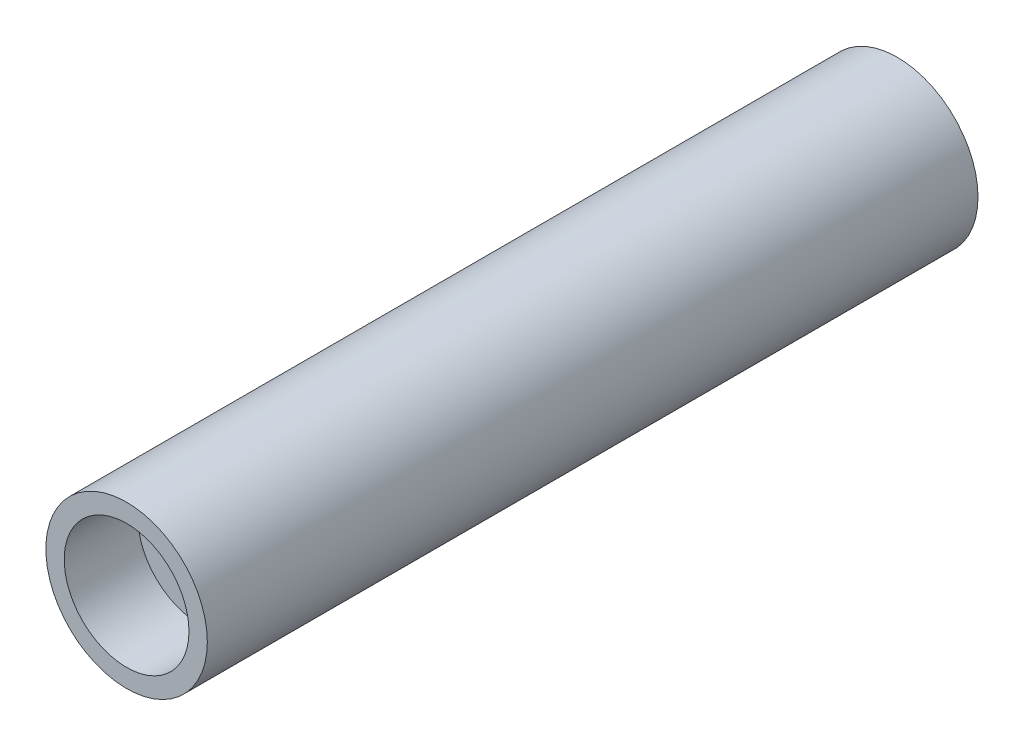
ISO-10303-21;
HEADER;
FILE_DESCRIPTION(('STEP AP214'),'2;1');
FILE_NAME('part.step','',(''),(''),'','','');
FILE_SCHEMA(('AUTOMOTIVE_DESIGN { 1 0 10303 214 1 1 1 1 }'));
ENDSEC;
DATA;
#1=APPLICATION_CONTEXT('core data for automotive mechanical design processes');
#2=APPLICATION_PROTOCOL_DEFINITION('international standard','automotive_design',2000,#1);
#3=PRODUCT_CONTEXT('',#1,'mechanical');
#4=PRODUCT('Part','Part','',(#3));
#5=PRODUCT_RELATED_PRODUCT_CATEGORY('part','',(#4));
#6=PRODUCT_DEFINITION_FORMATION('','',#4);
#7=PRODUCT_DEFINITION_CONTEXT('part definition',#1,'design');
#8=PRODUCT_DEFINITION('design','',#6,#7);
#9=PRODUCT_DEFINITION_SHAPE('','',#8);
#10=(LENGTH_UNIT() NAMED_UNIT(*) SI_UNIT(.MILLI.,.METRE.));
#11=(NAMED_UNIT(*) PLANE_ANGLE_UNIT() SI_UNIT($,.RADIAN.));
#12=(NAMED_UNIT(*) SI_UNIT($,.STERADIAN.) SOLID_ANGLE_UNIT());
#13=UNCERTAINTY_MEASURE_WITH_UNIT(LENGTH_MEASURE(1.E-05),#10,'distance_accuracy_value','');
#14=(GEOMETRIC_REPRESENTATION_CONTEXT(3) GLOBAL_UNCERTAINTY_ASSIGNED_CONTEXT((#13)) GLOBAL_UNIT_ASSIGNED_CONTEXT((#10,
#11,#12)) REPRESENTATION_CONTEXT('',''));
#15=CARTESIAN_POINT('',(0.,0.,0.));
#16=DIRECTION('',(0.,0.,1.));
#17=DIRECTION('',(1.,0.,0.));
#18=AXIS2_PLACEMENT_3D('',#15,#16,#17);
#19=CARTESIAN_POINT('',(0.,0.,-177.941839764448));
#20=DIRECTION('',(0.,0.,1.));
#21=DIRECTION('',(1.,0.,0.));
#22=AXIS2_PLACEMENT_3D('',#19,#20,#21);
#23=CYLINDRICAL_SURFACE('',#22,16.95);
#24=CARTESIAN_POINT('',(0.,0.,40.));
#25=DIRECTION('',(0.,0.,1.));
#26=DIRECTION('',(1.,0.,0.));
#27=AXIS2_PLACEMENT_3D('',#24,#25,#26);
#28=CIRCLE('',#27,16.95);
#29=CARTESIAN_POINT('',(16.95,0.,40.));
#30=VERTEX_POINT('',#29);
#31=EDGE_CURVE('E52',#30,#30,#28,.F.);
#32=ORIENTED_EDGE('',*,*,#31,.F.);
#33=EDGE_LOOP('',(#32));
#34=FACE_BOUND('',#33,.T.);
#35=CARTESIAN_POINT('',(0.,0.,190.));
#36=DIRECTION('',(0.,0.,1.));
#37=DIRECTION('',(1.,0.,0.));
#38=AXIS2_PLACEMENT_3D('',#35,#36,#37);
#39=CIRCLE('',#38,16.95);
#40=CARTESIAN_POINT('',(16.95,0.,190.));
#41=VERTEX_POINT('',#40);
#42=EDGE_CURVE('E56',#41,#41,#39,.T.);
#43=ORIENTED_EDGE('',*,*,#42,.F.);
#44=EDGE_LOOP('',(#43));
#45=FACE_BOUND('',#44,.T.);
#46=ADVANCED_FACE('F46',(#34,#45),#23,.T.);
#47=CARTESIAN_POINT('',(0.,0.,190.));
#48=DIRECTION('',(0.,0.,1.));
#49=DIRECTION('',(1.,0.,0.));
#50=AXIS2_PLACEMENT_3D('',#47,#48,#49);
#51=PLANE('',#50);
#52=CARTESIAN_POINT('',(0.,0.,190.));
#53=DIRECTION('',(0.,0.,1.));
#54=DIRECTION('',(1.,0.,0.));
#55=AXIS2_PLACEMENT_3D('',#52,#53,#54);
#56=CIRCLE('',#55,5.);
#57=CARTESIAN_POINT('',(5.,0.,190.));
#58=VERTEX_POINT('',#57);
#59=EDGE_CURVE('E61',#58,#58,#56,.T.);
#60=ORIENTED_EDGE('',*,*,#59,.F.);
#61=EDGE_LOOP('',(#60));
#62=FACE_BOUND('',#61,.T.);
#63=ORIENTED_EDGE('',*,*,#42,.T.);
#64=EDGE_LOOP('',(#63));
#65=FACE_BOUND('',#64,.T.);
#66=ADVANCED_FACE('F68',(#62,#65),#51,.T.);
#67=CARTESIAN_POINT('',(0.,0.,-177.941839764448));
#68=DIRECTION('',(0.,0.,1.));
#69=DIRECTION('',(1.,0.,0.));
#70=AXIS2_PLACEMENT_3D('',#67,#68,#69);
#71=CYLINDRICAL_SURFACE('',#70,5.);
#72=CARTESIAN_POINT('',(0.,0.,40.));
#73=DIRECTION('',(0.,0.,1.));
#74=DIRECTION('',(1.,0.,0.));
#75=AXIS2_PLACEMENT_3D('',#72,#73,#74);
#76=CIRCLE('',#75,5.);
#77=CARTESIAN_POINT('',(5.,0.,40.));
#78=VERTEX_POINT('',#77);
#79=EDGE_CURVE('E11',#78,#78,#76,.F.);
#80=ORIENTED_EDGE('',*,*,#79,.T.);
#81=EDGE_LOOP('',(#80));
#82=FACE_BOUND('',#81,.T.);
#83=ORIENTED_EDGE('',*,*,#59,.T.);
#84=EDGE_LOOP('',(#83));
#85=FACE_BOUND('',#84,.T.);
#86=ADVANCED_FACE('F66',(#82,#85),#71,.F.);
#87=CARTESIAN_POINT('',(0.,0.,40.));
#88=DIRECTION('',(0.,0.,1.));
#89=DIRECTION('',(1.,0.,0.));
#90=AXIS2_PLACEMENT_3D('',#87,#88,#89);
#91=PLANE('',#90);
#92=ORIENTED_EDGE('',*,*,#31,.T.);
#93=EDGE_LOOP('',(#92));
#94=FACE_BOUND('',#93,.T.);
#95=ORIENTED_EDGE('',*,*,#79,.F.);
#96=EDGE_LOOP('',(#95));
#97=FACE_BOUND('',#96,.T.);
#98=ADVANCED_FACE('F87',(#94,#97),#91,.F.);
#99=CLOSED_SHELL('',(#46,#66,#86,#98));
#100=MANIFOLD_SOLID_BREP('B2',#99);
#101=CARTESIAN_POINT('',(0.,0.,210.));
#102=DIRECTION('',(0.,0.,1.));
#103=DIRECTION('',(1.,0.,0.));
#104=AXIS2_PLACEMENT_3D('',#101,#102,#103);
#105=PLANE('',#104);
#106=CARTESIAN_POINT('',(0.,0.,210.));
#107=DIRECTION('',(0.,0.,1.));
#108=DIRECTION('',(1.,0.,0.));
#109=AXIS2_PLACEMENT_3D('',#106,#107,#108);
#110=CIRCLE('',#109,22.);
#111=CARTESIAN_POINT('',(22.,0.,210.));
#112=VERTEX_POINT('',#111);
#113=EDGE_CURVE('E45',#112,#112,#110,.T.);
#114=ORIENTED_EDGE('',*,*,#113,.T.);
#115=EDGE_LOOP('',(#114));
#116=FACE_BOUND('',#115,.T.);
#117=CARTESIAN_POINT('',(0.,0.,210.));
#118=DIRECTION('',(0.,0.,1.));
#119=DIRECTION('',(1.,0.,0.));
#120=AXIS2_PLACEMENT_3D('',#117,#118,#119);
#121=CIRCLE('',#120,17.);
#122=CARTESIAN_POINT('',(17.,0.,210.));
#123=VERTEX_POINT('',#122);
#124=EDGE_CURVE('E121',#123,#123,#121,.T.);
#125=ORIENTED_EDGE('',*,*,#124,.F.);
#126=EDGE_LOOP('',(#125));
#127=FACE_BOUND('',#126,.T.);
#128=ADVANCED_FACE('F108',(#116,#127),#105,.T.);
#129=CARTESIAN_POINT('',(0.,0.,0.));
#130=DIRECTION('',(0.,0.,1.));
#131=DIRECTION('',(1.,0.,0.));
#132=AXIS2_PLACEMENT_3D('',#129,#130,#131);
#133=PLANE('',#132);
#134=CARTESIAN_POINT('',(0.,0.,0.));
#135=DIRECTION('',(0.,0.,1.));
#136=DIRECTION('',(1.,0.,0.));
#137=AXIS2_PLACEMENT_3D('',#134,#135,#136);
#138=CIRCLE('',#137,22.);
#139=CARTESIAN_POINT('',(22.,0.,0.));
#140=VERTEX_POINT('',#139);
#141=EDGE_CURVE('E112',#140,#140,#138,.T.);
#142=ORIENTED_EDGE('',*,*,#141,.F.);
#143=EDGE_LOOP('',(#142));
#144=FACE_BOUND('',#143,.T.);
#145=CARTESIAN_POINT('',(0.,0.,0.));
#146=DIRECTION('',(0.,0.,1.));
#147=DIRECTION('',(1.,0.,0.));
#148=AXIS2_PLACEMENT_3D('',#145,#146,#147);
#149=CIRCLE('',#148,17.);
#150=CARTESIAN_POINT('',(17.,0.,0.));
#151=VERTEX_POINT('',#150);
#152=EDGE_CURVE('E123',#151,#151,#149,.T.);
#153=ORIENTED_EDGE('',*,*,#152,.T.);
#154=EDGE_LOOP('',(#153));
#155=FACE_BOUND('',#154,.T.);
#156=ADVANCED_FACE('F135',(#144,#155),#133,.F.);
#157=CARTESIAN_POINT('',(0.,0.,210.));
#158=DIRECTION('',(0.,0.,-1.));
#159=DIRECTION('',(-1.,0.,0.));
#160=AXIS2_PLACEMENT_3D('',#157,#158,#159);
#161=CYLINDRICAL_SURFACE('',#160,22.);
#162=ORIENTED_EDGE('',*,*,#113,.F.);
#163=EDGE_LOOP('',(#162));
#164=FACE_BOUND('',#163,.T.);
#165=ORIENTED_EDGE('',*,*,#141,.T.);
#166=EDGE_LOOP('',(#165));
#167=FACE_BOUND('',#166,.T.);
#168=ADVANCED_FACE('F110',(#164,#167),#161,.T.);
#169=CARTESIAN_POINT('',(0.,0.,210.));
#170=DIRECTION('',(0.,0.,-1.));
#171=DIRECTION('',(-1.,0.,0.));
#172=AXIS2_PLACEMENT_3D('',#169,#170,#171);
#173=CYLINDRICAL_SURFACE('',#172,17.);
#174=ORIENTED_EDGE('',*,*,#124,.T.);
#175=EDGE_LOOP('',(#174));
#176=FACE_BOUND('',#175,.T.);
#177=ORIENTED_EDGE('',*,*,#152,.F.);
#178=EDGE_LOOP('',(#177));
#179=FACE_BOUND('',#178,.T.);
#180=ADVANCED_FACE('F131',(#176,#179),#173,.F.);
#181=CLOSED_SHELL('',(#128,#156,#168,#180));
#182=MANIFOLD_SOLID_BREP('B6',#181);
#183=ADVANCED_BREP_SHAPE_REPRESENTATION('',(#18,#100,#182),#14);
#184=SHAPE_DEFINITION_REPRESENTATION(#9,#183);
ENDSEC;
END-ISO-10303-21;
